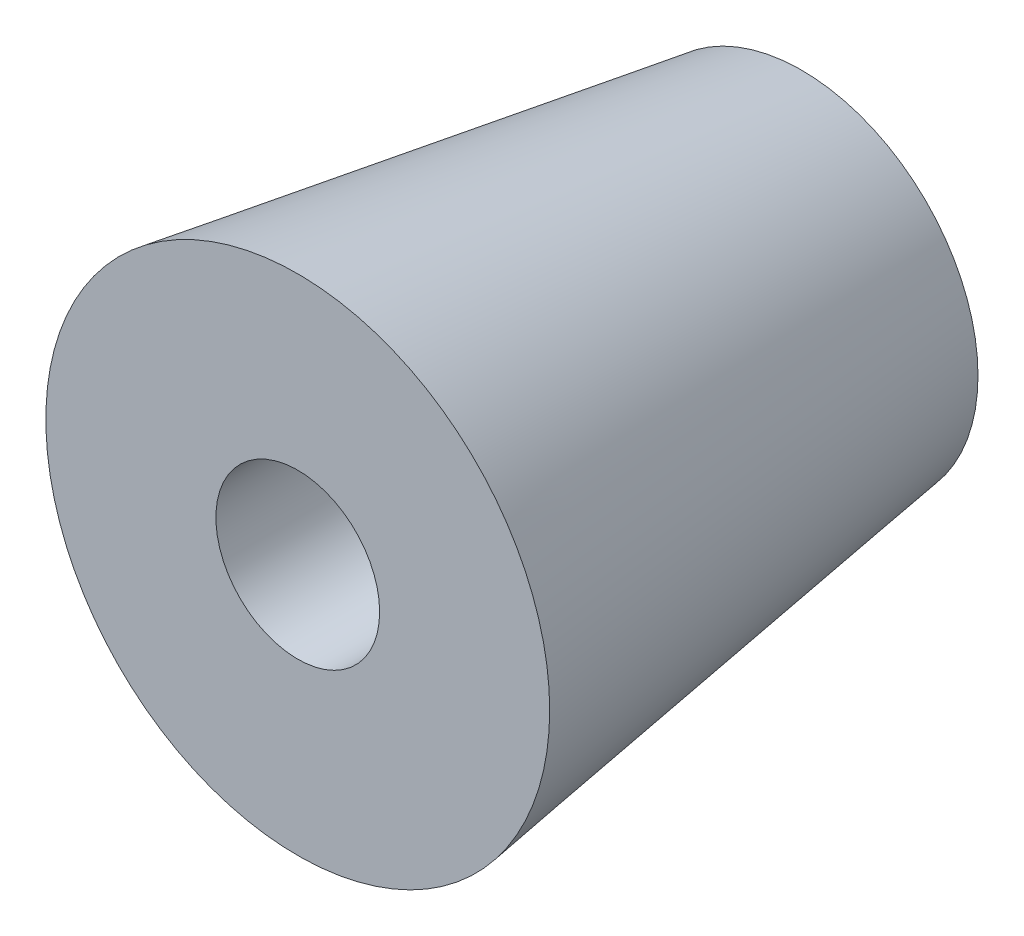
ISO-10303-21;
HEADER;
FILE_DESCRIPTION(('STEP AP214'),'2;1');
FILE_NAME('part.step','',(''),(''),'','','');
FILE_SCHEMA(('AUTOMOTIVE_DESIGN { 1 0 10303 214 1 1 1 1 }'));
ENDSEC;
DATA;
#1=APPLICATION_CONTEXT('core data for automotive mechanical design processes');
#2=APPLICATION_PROTOCOL_DEFINITION('international standard','automotive_design',2000,#1);
#3=PRODUCT_CONTEXT('',#1,'mechanical');
#4=PRODUCT('Part','Part','',(#3));
#5=PRODUCT_RELATED_PRODUCT_CATEGORY('part','',(#4));
#6=PRODUCT_DEFINITION_FORMATION('','',#4);
#7=PRODUCT_DEFINITION_CONTEXT('part definition',#1,'design');
#8=PRODUCT_DEFINITION('design','',#6,#7);
#9=PRODUCT_DEFINITION_SHAPE('','',#8);
#10=(LENGTH_UNIT() NAMED_UNIT(*) SI_UNIT(.MILLI.,.METRE.));
#11=(NAMED_UNIT(*) PLANE_ANGLE_UNIT() SI_UNIT($,.RADIAN.));
#12=(NAMED_UNIT(*) SI_UNIT($,.STERADIAN.) SOLID_ANGLE_UNIT());
#13=UNCERTAINTY_MEASURE_WITH_UNIT(LENGTH_MEASURE(1.E-05),#10,'distance_accuracy_value','');
#14=(GEOMETRIC_REPRESENTATION_CONTEXT(3) GLOBAL_UNCERTAINTY_ASSIGNED_CONTEXT((#13)) GLOBAL_UNIT_ASSIGNED_CONTEXT((#10,
#11,#12)) REPRESENTATION_CONTEXT('',''));
#15=CARTESIAN_POINT('',(0.,0.,0.));
#16=DIRECTION('',(0.,0.,1.));
#17=DIRECTION('',(1.,0.,0.));
#18=AXIS2_PLACEMENT_3D('',#15,#16,#17);
#19=CARTESIAN_POINT('',(484.453522857105,15.7061577866723,0.));
#20=DIRECTION('',(0.,0.,1.));
#21=DIRECTION('',(1.,0.,0.));
#22=AXIS2_PLACEMENT_3D('',#19,#20,#21);
#23=CONICAL_SURFACE('',#22,20.,0.148876585195117);
#24=CARTESIAN_POINT('',(484.453522857105,15.7061577866723,-40.));
#25=DIRECTION('',(0.,0.,1.));
#26=DIRECTION('',(1.,0.,0.));
#27=AXIS2_PLACEMENT_3D('',#24,#25,#26);
#28=CIRCLE('',#27,14.0005465216528);
#29=CARTESIAN_POINT('',(498.454069378757,15.7061577866723,-40.));
#30=VERTEX_POINT('',#29);
#31=EDGE_CURVE('E10',#30,#30,#28,.T.);
#32=ORIENTED_EDGE('',*,*,#31,.T.);
#33=EDGE_LOOP('',(#32));
#34=FACE_BOUND('',#33,.T.);
#35=CARTESIAN_POINT('',(484.453522857105,15.7061577866723,0.));
#36=DIRECTION('',(0.,0.,1.));
#37=DIRECTION('',(1.,0.,0.));
#38=AXIS2_PLACEMENT_3D('',#35,#36,#37);
#39=CIRCLE('',#38,20.);
#40=CARTESIAN_POINT('',(504.453522857105,15.7061577866723,0.));
#41=VERTEX_POINT('',#40);
#42=EDGE_CURVE('E41',#41,#41,#39,.T.);
#43=ORIENTED_EDGE('',*,*,#42,.F.);
#44=EDGE_LOOP('',(#43));
#45=FACE_BOUND('',#44,.T.);
#46=ADVANCED_FACE('F35',(#34,#45),#23,.T.);
#47=CARTESIAN_POINT('',(484.453522857105,15.7061577866723,-40.));
#48=DIRECTION('',(0.,0.,1.));
#49=DIRECTION('',(1.,0.,0.));
#50=AXIS2_PLACEMENT_3D('',#47,#48,#49);
#51=PLANE('',#50);
#52=CARTESIAN_POINT('',(484.453522857105,15.7061577866723,-40.));
#53=DIRECTION('',(0.,0.,1.));
#54=DIRECTION('',(1.,0.,0.));
#55=AXIS2_PLACEMENT_3D('',#52,#53,#54);
#56=CIRCLE('',#55,6.50000000000002);
#57=CARTESIAN_POINT('',(490.953522857105,15.7061577866723,-40.));
#58=VERTEX_POINT('',#57);
#59=EDGE_CURVE('E45',#58,#58,#56,.T.);
#60=ORIENTED_EDGE('',*,*,#59,.T.);
#61=EDGE_LOOP('',(#60));
#62=FACE_BOUND('',#61,.T.);
#63=ORIENTED_EDGE('',*,*,#31,.F.);
#64=EDGE_LOOP('',(#63));
#65=FACE_BOUND('',#64,.T.);
#66=ADVANCED_FACE('F59',(#62,#65),#51,.F.);
#67=CARTESIAN_POINT('',(484.453522857105,15.7061577866723,0.));
#68=DIRECTION('',(0.,0.,1.));
#69=DIRECTION('',(1.,0.,0.));
#70=AXIS2_PLACEMENT_3D('',#67,#68,#69);
#71=PLANE('',#70);
#72=CARTESIAN_POINT('',(484.453522857105,15.7061577866723,0.));
#73=DIRECTION('',(0.,0.,1.));
#74=DIRECTION('',(1.,0.,0.));
#75=AXIS2_PLACEMENT_3D('',#72,#73,#74);
#76=CIRCLE('',#75,6.50000000000002);
#77=CARTESIAN_POINT('',(490.953522857105,15.7061577866723,0.));
#78=VERTEX_POINT('',#77);
#79=EDGE_CURVE('E49',#78,#78,#76,.T.);
#80=ORIENTED_EDGE('',*,*,#79,.F.);
#81=EDGE_LOOP('',(#80));
#82=FACE_BOUND('',#81,.T.);
#83=ORIENTED_EDGE('',*,*,#42,.T.);
#84=EDGE_LOOP('',(#83));
#85=FACE_BOUND('',#84,.T.);
#86=ADVANCED_FACE('F57',(#82,#85),#71,.T.);
#87=CARTESIAN_POINT('',(484.453522857105,15.7061577866723,-40.));
#88=DIRECTION('',(0.,0.,1.));
#89=DIRECTION('',(1.,0.,0.));
#90=AXIS2_PLACEMENT_3D('',#87,#88,#89);
#91=CYLINDRICAL_SURFACE('',#90,6.50000000000002);
#92=ORIENTED_EDGE('',*,*,#59,.F.);
#93=EDGE_LOOP('',(#92));
#94=FACE_BOUND('',#93,.T.);
#95=ORIENTED_EDGE('',*,*,#79,.T.);
#96=EDGE_LOOP('',(#95));
#97=FACE_BOUND('',#96,.T.);
#98=ADVANCED_FACE('F55',(#94,#97),#91,.F.);
#99=CLOSED_SHELL('',(#46,#66,#86,#98));
#100=MANIFOLD_SOLID_BREP('B2',#99);
#101=ADVANCED_BREP_SHAPE_REPRESENTATION('',(#18,#100),#14);
#102=SHAPE_DEFINITION_REPRESENTATION(#9,#101);
ENDSEC;
END-ISO-10303-21;
